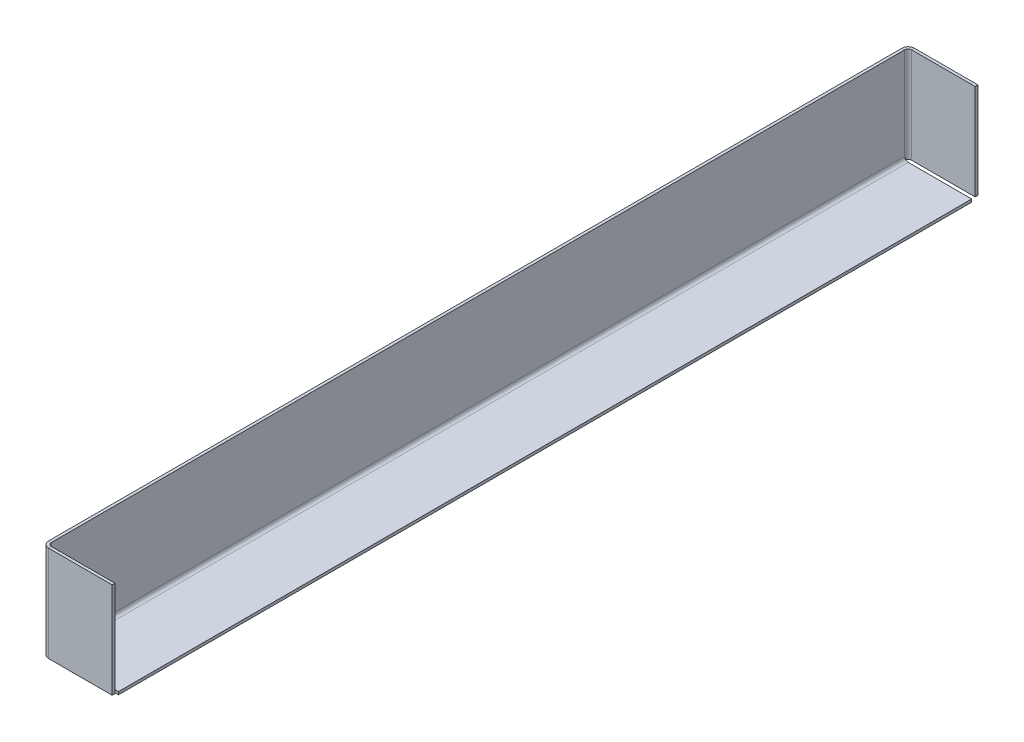
ISO-10303-21;
HEADER;
FILE_DESCRIPTION(('STEP AP214'),'2;1');
FILE_NAME('part.step','',(''),(''),'','','');
FILE_SCHEMA(('AUTOMOTIVE_DESIGN { 1 0 10303 214 1 1 1 1 }'));
ENDSEC;
DATA;
#1=APPLICATION_CONTEXT('core data for automotive mechanical design processes');
#2=APPLICATION_PROTOCOL_DEFINITION('international standard','automotive_design',2000,#1);
#3=PRODUCT_CONTEXT('',#1,'mechanical');
#4=PRODUCT('Part','Part','',(#3));
#5=PRODUCT_RELATED_PRODUCT_CATEGORY('part','',(#4));
#6=PRODUCT_DEFINITION_FORMATION('','',#4);
#7=PRODUCT_DEFINITION_CONTEXT('part definition',#1,'design');
#8=PRODUCT_DEFINITION('design','',#6,#7);
#9=PRODUCT_DEFINITION_SHAPE('','',#8);
#10=(LENGTH_UNIT() NAMED_UNIT(*) SI_UNIT(.MILLI.,.METRE.));
#11=(NAMED_UNIT(*) PLANE_ANGLE_UNIT() SI_UNIT($,.RADIAN.));
#12=(NAMED_UNIT(*) SI_UNIT($,.STERADIAN.) SOLID_ANGLE_UNIT());
#13=UNCERTAINTY_MEASURE_WITH_UNIT(LENGTH_MEASURE(1.E-05),#10,'distance_accuracy_value','');
#14=(GEOMETRIC_REPRESENTATION_CONTEXT(3) GLOBAL_UNCERTAINTY_ASSIGNED_CONTEXT((#13)) GLOBAL_UNIT_ASSIGNED_CONTEXT((#10,
#11,#12)) REPRESENTATION_CONTEXT('',''));
#15=CARTESIAN_POINT('',(0.,0.,0.));
#16=DIRECTION('',(0.,0.,1.));
#17=DIRECTION('',(1.,0.,0.));
#18=AXIS2_PLACEMENT_3D('',#15,#16,#17);
#19=CARTESIAN_POINT('',(0.799999999999981,-13.7,-122.2));
#20=DIRECTION('',(0.,0.,1.));
#21=DIRECTION('',(1.,0.,0.));
#22=AXIS2_PLACEMENT_3D('',#19,#20,#21);
#23=PLANE('',#22);
#24=DIRECTION('',(-1.,0.,0.));
#25=VECTOR('',#24,1.);
#26=CARTESIAN_POINT('',(0.799999999999981,-13.7,-122.2));
#27=LINE('',#26,#25);
#28=CARTESIAN_POINT('',(0.30333704529039,-13.7,-122.2));
#29=VERTEX_POINT('',#28);
#30=CARTESIAN_POINT('',(0.,-13.7,-122.2));
#31=VERTEX_POINT('',#30);
#32=EDGE_CURVE('E57',#29,#31,#27,.T.);
#33=ORIENTED_EDGE('',*,*,#32,.F.);
#34=CARTESIAN_POINT('',(1.79999999999999,-12.7,-122.2));
#35=DIRECTION('',(0.,0.,-1.));
#36=DIRECTION('',(-1.,0.,0.));
#37=AXIS2_PLACEMENT_3D('',#34,#35,#36);
#38=CIRCLE('',#37,1.80000000000001);
#39=CARTESIAN_POINT('',(0.,-12.7,-122.2));
#40=VERTEX_POINT('',#39);
#41=EDGE_CURVE('E11',#29,#40,#38,.T.);
#42=ORIENTED_EDGE('',*,*,#41,.T.);
#43=DIRECTION('',(0.,1.,0.));
#44=VECTOR('',#43,1.);
#45=CARTESIAN_POINT('',(0.,13.7,-122.2));
#46=LINE('',#45,#44);
#47=EDGE_CURVE('E241',#31,#40,#46,.T.);
#48=ORIENTED_EDGE('',*,*,#47,.F.);
#49=EDGE_LOOP('',(#33,#42,#48));
#50=FACE_BOUND('',#49,.T.);
#51=ADVANCED_FACE('F40',(#50),#23,.T.);
#52=CARTESIAN_POINT('',(0.799999999999986,-12.7,122.2));
#53=DIRECTION('',(0.,0.,-1.));
#54=DIRECTION('',(-1.,0.,0.));
#55=AXIS2_PLACEMENT_3D('',#52,#53,#54);
#56=PLANE('',#55);
#57=DIRECTION('',(0.,-1.,0.));
#58=VECTOR('',#57,1.);
#59=CARTESIAN_POINT('',(0.,-13.7,122.2));
#60=LINE('',#59,#58);
#61=CARTESIAN_POINT('',(0.,-13.7,122.2));
#62=VERTEX_POINT('',#61);
#63=CARTESIAN_POINT('',(0.,-12.7,122.2));
#64=VERTEX_POINT('',#63);
#65=EDGE_CURVE('E328',#62,#64,#60,.F.);
#66=ORIENTED_EDGE('',*,*,#65,.T.);
#67=CARTESIAN_POINT('',(1.79999999999999,-12.7,122.2));
#68=DIRECTION('',(0.,0.,-1.));
#69=DIRECTION('',(-1.,0.,0.));
#70=AXIS2_PLACEMENT_3D('',#67,#68,#69);
#71=CIRCLE('',#70,1.80000000000001);
#72=CARTESIAN_POINT('',(0.303337045290411,-13.7,122.2));
#73=VERTEX_POINT('',#72);
#74=EDGE_CURVE('E230',#64,#73,#71,.F.);
#75=ORIENTED_EDGE('',*,*,#74,.T.);
#76=DIRECTION('',(-1.,0.,0.));
#77=VECTOR('',#76,1.);
#78=CARTESIAN_POINT('',(0.799999999999995,-13.7,122.2));
#79=LINE('',#78,#77);
#80=EDGE_CURVE('E333',#73,#62,#79,.T.);
#81=ORIENTED_EDGE('',*,*,#80,.T.);
#82=EDGE_LOOP('',(#66,#75,#81));
#83=FACE_BOUND('',#82,.T.);
#84=ADVANCED_FACE('F401',(#83),#56,.T.);
#85=CARTESIAN_POINT('',(0.8,0.,0.));
#86=DIRECTION('',(-1.,0.,0.));
#87=DIRECTION('',(0.,0.,1.));
#88=AXIS2_PLACEMENT_3D('',#85,#86,#87);
#89=PLANE('',#88);
#90=DIRECTION('',(0.,0.,-1.));
#91=VECTOR('',#90,1.);
#92=CARTESIAN_POINT('',(0.799999999999986,-12.7,-122.2));
#93=LINE('',#92,#91);
#94=CARTESIAN_POINT('',(0.799999999999986,-12.7,-122.2));
#95=VERTEX_POINT('',#94);
#96=CARTESIAN_POINT('',(0.799999999999986,-12.7,122.2));
#97=VERTEX_POINT('',#96);
#98=EDGE_CURVE('E236',#95,#97,#93,.F.);
#99=ORIENTED_EDGE('',*,*,#98,.F.);
#100=DIRECTION('',(0.,1.,0.));
#101=VECTOR('',#100,1.);
#102=CARTESIAN_POINT('',(0.799999999999981,13.7,-122.2));
#103=LINE('',#102,#101);
#104=CARTESIAN_POINT('',(0.799999999999981,13.7,-122.2));
#105=VERTEX_POINT('',#104);
#106=EDGE_CURVE('E288',#105,#95,#103,.F.);
#107=ORIENTED_EDGE('',*,*,#106,.F.);
#108=DIRECTION('',(0.,0.,1.));
#109=VECTOR('',#108,1.);
#110=CARTESIAN_POINT('',(0.8,13.7,-123.2));
#111=LINE('',#110,#109);
#112=CARTESIAN_POINT('',(0.799999999999995,13.7,122.2));
#113=VERTEX_POINT('',#112);
#114=EDGE_CURVE('E49',#105,#113,#111,.T.);
#115=ORIENTED_EDGE('',*,*,#114,.T.);
#116=DIRECTION('',(0.,-1.,0.));
#117=VECTOR('',#116,1.);
#118=CARTESIAN_POINT('',(0.799999999999995,-13.7,122.2));
#119=LINE('',#118,#117);
#120=EDGE_CURVE('E343',#97,#113,#119,.F.);
#121=ORIENTED_EDGE('',*,*,#120,.F.);
#122=EDGE_LOOP('',(#99,#107,#115,#121));
#123=FACE_BOUND('',#122,.T.);
#124=ADVANCED_FACE('F406',(#123),#89,.F.);
#125=CARTESIAN_POINT('',(0.,0.,0.));
#126=DIRECTION('',(-1.,0.,0.));
#127=DIRECTION('',(0.,0.,1.));
#128=AXIS2_PLACEMENT_3D('',#125,#126,#127);
#129=PLANE('',#128);
#130=DIRECTION('',(0.,1.,0.));
#131=VECTOR('',#130,1.);
#132=CARTESIAN_POINT('',(0.,13.7,-122.2));
#133=LINE('',#132,#131);
#134=CARTESIAN_POINT('',(0.,13.7,-122.2));
#135=VERTEX_POINT('',#134);
#136=EDGE_CURVE('E275',#135,#40,#133,.F.);
#137=ORIENTED_EDGE('',*,*,#136,.T.);
#138=DIRECTION('',(0.,0.,-1.));
#139=VECTOR('',#138,1.);
#140=CARTESIAN_POINT('',(0.,-12.7,-122.2));
#141=LINE('',#140,#139);
#142=EDGE_CURVE('E185',#40,#64,#141,.F.);
#143=ORIENTED_EDGE('',*,*,#142,.T.);
#144=CARTESIAN_POINT('',(0.,13.7,122.2));
#145=VERTEX_POINT('',#144);
#146=EDGE_CURVE('E65',#64,#145,#60,.F.);
#147=ORIENTED_EDGE('',*,*,#146,.T.);
#148=DIRECTION('',(0.,0.,1.));
#149=VECTOR('',#148,1.);
#150=CARTESIAN_POINT('',(0.,13.7,-123.2));
#151=LINE('',#150,#149);
#152=EDGE_CURVE('E44',#135,#145,#151,.T.);
#153=ORIENTED_EDGE('',*,*,#152,.F.);
#154=EDGE_LOOP('',(#137,#143,#147,#153));
#155=FACE_BOUND('',#154,.T.);
#156=ADVANCED_FACE('F461',(#155),#129,.T.);
#157=CARTESIAN_POINT('',(0.8,13.7,-123.2));
#158=DIRECTION('',(0.,-1.,0.));
#159=DIRECTION('',(0.,0.,-1.));
#160=AXIS2_PLACEMENT_3D('',#157,#158,#159);
#161=PLANE('',#160);
#162=DIRECTION('',(-1.,0.,0.));
#163=VECTOR('',#162,1.);
#164=CARTESIAN_POINT('',(0.799999999999981,13.7,-122.2));
#165=LINE('',#164,#163);
#166=EDGE_CURVE('E282',#105,#135,#165,.T.);
#167=ORIENTED_EDGE('',*,*,#166,.T.);
#168=ORIENTED_EDGE('',*,*,#152,.T.);
#169=DIRECTION('',(-1.,0.,0.));
#170=VECTOR('',#169,1.);
#171=CARTESIAN_POINT('',(0.799999999999995,13.7,122.2));
#172=LINE('',#171,#170);
#173=EDGE_CURVE('E346',#113,#145,#172,.T.);
#174=ORIENTED_EDGE('',*,*,#173,.F.);
#175=ORIENTED_EDGE('',*,*,#114,.F.);
#176=EDGE_LOOP('',(#167,#168,#174,#175));
#177=FACE_BOUND('',#176,.T.);
#178=ADVANCED_FACE('F42',(#177),#161,.F.);
#179=CARTESIAN_POINT('',(1.8,13.7,122.2));
#180=DIRECTION('',(0.,1.,0.));
#181=DIRECTION('',(0.,0.,1.));
#182=AXIS2_PLACEMENT_3D('',#179,#180,#181);
#183=PLANE('',#182);
#184=DIRECTION('',(0.,0.,1.));
#185=VECTOR('',#184,1.);
#186=CARTESIAN_POINT('',(1.8,13.7,123.2));
#187=LINE('',#186,#185);
#188=CARTESIAN_POINT('',(1.79999999999999,13.7,123.2));
#189=VERTEX_POINT('',#188);
#190=CARTESIAN_POINT('',(1.79999999999999,13.7,124.));
#191=VERTEX_POINT('',#190);
#192=EDGE_CURVE('E295',#189,#191,#187,.T.);
#193=ORIENTED_EDGE('',*,*,#192,.F.);
#194=CARTESIAN_POINT('',(1.8,13.7,122.2));
#195=DIRECTION('',(0.,-1.,0.));
#196=DIRECTION('',(0.,0.,-1.));
#197=AXIS2_PLACEMENT_3D('',#194,#195,#196);
#198=CIRCLE('',#197,1.);
#199=EDGE_CURVE('E337',#113,#189,#198,.F.);
#200=ORIENTED_EDGE('',*,*,#199,.F.);
#201=ORIENTED_EDGE('',*,*,#173,.T.);
#202=CARTESIAN_POINT('',(1.8,13.7,122.2));
#203=DIRECTION('',(0.,-1.,0.));
#204=DIRECTION('',(0.,0.,-1.));
#205=AXIS2_PLACEMENT_3D('',#202,#203,#204);
#206=CIRCLE('',#205,1.8);
#207=EDGE_CURVE('E330',#145,#191,#206,.F.);
#208=ORIENTED_EDGE('',*,*,#207,.T.);
#209=EDGE_LOOP('',(#193,#200,#201,#208));
#210=FACE_BOUND('',#209,.T.);
#211=ADVANCED_FACE('F365',(#210),#183,.T.);
#212=CARTESIAN_POINT('',(1.8,-13.7,122.2));
#213=DIRECTION('',(0.,1.,0.));
#214=DIRECTION('',(0.,0.,1.));
#215=AXIS2_PLACEMENT_3D('',#212,#213,#214);
#216=PLANE('',#215);
#217=CARTESIAN_POINT('',(1.8,-13.7,122.2));
#218=DIRECTION('',(0.,-1.,0.));
#219=DIRECTION('',(0.,0.,-1.));
#220=AXIS2_PLACEMENT_3D('',#217,#218,#219);
#221=CIRCLE('',#220,1.);
#222=CARTESIAN_POINT('',(1.79999999999999,-13.7,123.2));
#223=VERTEX_POINT('',#222);
#224=CARTESIAN_POINT('',(0.799999999999995,-13.7,122.2));
#225=VERTEX_POINT('',#224);
#226=EDGE_CURVE('E327',#223,#225,#221,.T.);
#227=ORIENTED_EDGE('',*,*,#226,.F.);
#228=DIRECTION('',(0.,0.,1.));
#229=VECTOR('',#228,1.);
#230=CARTESIAN_POINT('',(1.8,-13.7,123.2));
#231=LINE('',#230,#229);
#232=CARTESIAN_POINT('',(1.8,-13.7,124.));
#233=VERTEX_POINT('',#232);
#234=EDGE_CURVE('E300',#223,#233,#231,.T.);
#235=ORIENTED_EDGE('',*,*,#234,.T.);
#236=CARTESIAN_POINT('',(1.8,-13.7,122.2));
#237=DIRECTION('',(0.,-1.,0.));
#238=DIRECTION('',(0.,0.,-1.));
#239=AXIS2_PLACEMENT_3D('',#236,#237,#238);
#240=CIRCLE('',#239,1.8);
#241=EDGE_CURVE('E334',#233,#62,#240,.T.);
#242=ORIENTED_EDGE('',*,*,#241,.T.);
#243=ORIENTED_EDGE('',*,*,#80,.F.);
#244=EDGE_CURVE('E349',#225,#73,#79,.T.);
#245=ORIENTED_EDGE('',*,*,#244,.F.);
#246=EDGE_LOOP('',(#227,#235,#242,#243,#245));
#247=FACE_BOUND('',#246,.T.);
#248=ADVANCED_FACE('F388',(#247),#216,.F.);
#249=CARTESIAN_POINT('',(1.8,-13.7,122.2));
#250=DIRECTION('',(0.,-1.,0.));
#251=DIRECTION('',(0.,0.,1.));
#252=AXIS2_PLACEMENT_3D('',#249,#250,#251);
#253=CYLINDRICAL_SURFACE('',#252,1.8);
#254=ORIENTED_EDGE('',*,*,#65,.F.);
#255=ORIENTED_EDGE('',*,*,#241,.F.);
#256=DIRECTION('',(0.,1.,0.));
#257=VECTOR('',#256,1.);
#258=CARTESIAN_POINT('',(1.8,0.,124.));
#259=LINE('',#258,#257);
#260=EDGE_CURVE('E303',#233,#191,#259,.T.);
#261=ORIENTED_EDGE('',*,*,#260,.T.);
#262=ORIENTED_EDGE('',*,*,#207,.F.);
#263=ORIENTED_EDGE('',*,*,#146,.F.);
#264=EDGE_LOOP('',(#254,#255,#261,#262,#263));
#265=FACE_BOUND('',#264,.T.);
#266=ADVANCED_FACE('F361',(#265),#253,.T.);
#267=CARTESIAN_POINT('',(1.8,-13.7,122.2));
#268=DIRECTION('',(0.,-1.,0.));
#269=DIRECTION('',(0.,0.,1.));
#270=AXIS2_PLACEMENT_3D('',#267,#268,#269);
#271=CYLINDRICAL_SURFACE('',#270,1.);
#272=EDGE_CURVE('E340',#225,#97,#119,.F.);
#273=ORIENTED_EDGE('',*,*,#272,.T.);
#274=ORIENTED_EDGE('',*,*,#120,.T.);
#275=ORIENTED_EDGE('',*,*,#199,.T.);
#276=DIRECTION('',(0.,-1.,0.));
#277=VECTOR('',#276,1.);
#278=CARTESIAN_POINT('',(1.8,13.7,123.2));
#279=LINE('',#278,#277);
#280=EDGE_CURVE('E298',#189,#223,#279,.T.);
#281=ORIENTED_EDGE('',*,*,#280,.T.);
#282=ORIENTED_EDGE('',*,*,#226,.T.);
#283=EDGE_LOOP('',(#273,#274,#275,#281,#282));
#284=FACE_BOUND('',#283,.T.);
#285=ADVANCED_FACE('F368',(#284),#271,.F.);
#286=CARTESIAN_POINT('',(20.,-13.7,124.));
#287=DIRECTION('',(0.,1.,0.));
#288=DIRECTION('',(0.,0.,1.));
#289=AXIS2_PLACEMENT_3D('',#286,#287,#288);
#290=PLANE('',#289);
#291=ORIENTED_EDGE('',*,*,#234,.F.);
#292=DIRECTION('',(1.,0.,0.));
#293=VECTOR('',#292,1.);
#294=CARTESIAN_POINT('',(20.,-13.7,123.2));
#295=LINE('',#294,#293);
#296=CARTESIAN_POINT('',(20.,-13.7,123.2));
#297=VERTEX_POINT('',#296);
#298=EDGE_CURVE('E307',#223,#297,#295,.T.);
#299=ORIENTED_EDGE('',*,*,#298,.T.);
#300=DIRECTION('',(0.,0.,-1.));
#301=VECTOR('',#300,1.);
#302=CARTESIAN_POINT('',(20.,-13.7,124.));
#303=LINE('',#302,#301);
#304=CARTESIAN_POINT('',(20.,-13.7,124.));
#305=VERTEX_POINT('',#304);
#306=EDGE_CURVE('E324',#305,#297,#303,.T.);
#307=ORIENTED_EDGE('',*,*,#306,.F.);
#308=DIRECTION('',(1.,0.,0.));
#309=VECTOR('',#308,1.);
#310=CARTESIAN_POINT('',(20.,-13.7,124.));
#311=LINE('',#310,#309);
#312=EDGE_CURVE('E308',#233,#305,#311,.T.);
#313=ORIENTED_EDGE('',*,*,#312,.F.);
#314=EDGE_LOOP('',(#291,#299,#307,#313));
#315=FACE_BOUND('',#314,.T.);
#316=ADVANCED_FACE('F386',(#315),#290,.F.);
#317=CARTESIAN_POINT('',(0.799999999999997,13.7,124.));
#318=DIRECTION('',(0.,-1.,0.));
#319=DIRECTION('',(0.,0.,-1.));
#320=AXIS2_PLACEMENT_3D('',#317,#318,#319);
#321=PLANE('',#320);
#322=ORIENTED_EDGE('',*,*,#192,.T.);
#323=DIRECTION('',(-1.,0.,0.));
#324=VECTOR('',#323,1.);
#325=CARTESIAN_POINT('',(0.799999999999997,13.7,124.));
#326=LINE('',#325,#324);
#327=CARTESIAN_POINT('',(20.,13.7,124.));
#328=VERTEX_POINT('',#327);
#329=EDGE_CURVE('E313',#328,#191,#326,.T.);
#330=ORIENTED_EDGE('',*,*,#329,.F.);
#331=DIRECTION('',(0.,0.,-1.));
#332=VECTOR('',#331,1.);
#333=CARTESIAN_POINT('',(20.,13.7,124.));
#334=LINE('',#333,#332);
#335=CARTESIAN_POINT('',(20.,13.7,123.2));
#336=VERTEX_POINT('',#335);
#337=EDGE_CURVE('E316',#328,#336,#334,.T.);
#338=ORIENTED_EDGE('',*,*,#337,.T.);
#339=DIRECTION('',(-1.,0.,0.));
#340=VECTOR('',#339,1.);
#341=CARTESIAN_POINT('',(0.8,13.7,123.2));
#342=LINE('',#341,#340);
#343=EDGE_CURVE('E311',#336,#189,#342,.T.);
#344=ORIENTED_EDGE('',*,*,#343,.T.);
#345=EDGE_LOOP('',(#322,#330,#338,#344));
#346=FACE_BOUND('',#345,.T.);
#347=ADVANCED_FACE('F376',(#346),#321,.F.);
#348=CARTESIAN_POINT('',(-4.48038877238455E-13,0.,124.));
#349=DIRECTION('',(0.,0.,-1.));
#350=DIRECTION('',(-1.,0.,0.));
#351=AXIS2_PLACEMENT_3D('',#348,#349,#350);
#352=PLANE('',#351);
#353=ORIENTED_EDGE('',*,*,#260,.F.);
#354=ORIENTED_EDGE('',*,*,#312,.T.);
#355=DIRECTION('',(0.,1.,0.));
#356=VECTOR('',#355,1.);
#357=CARTESIAN_POINT('',(20.,13.7,124.));
#358=LINE('',#357,#356);
#359=EDGE_CURVE('E310',#305,#328,#358,.T.);
#360=ORIENTED_EDGE('',*,*,#359,.T.);
#361=ORIENTED_EDGE('',*,*,#329,.T.);
#362=EDGE_LOOP('',(#353,#354,#360,#361));
#363=FACE_BOUND('',#362,.T.);
#364=ADVANCED_FACE('F390',(#363),#352,.F.);
#365=CARTESIAN_POINT('',(-4.45245692167381E-13,0.,123.2));
#366=DIRECTION('',(0.,0.,-1.));
#367=DIRECTION('',(-1.,0.,0.));
#368=AXIS2_PLACEMENT_3D('',#365,#366,#367);
#369=PLANE('',#368);
#370=ORIENTED_EDGE('',*,*,#298,.F.);
#371=ORIENTED_EDGE('',*,*,#280,.F.);
#372=ORIENTED_EDGE('',*,*,#343,.F.);
#373=DIRECTION('',(0.,1.,0.));
#374=VECTOR('',#373,1.);
#375=CARTESIAN_POINT('',(20.,13.7,123.2));
#376=LINE('',#375,#374);
#377=EDGE_CURVE('E318',#297,#336,#376,.T.);
#378=ORIENTED_EDGE('',*,*,#377,.F.);
#379=EDGE_LOOP('',(#370,#371,#372,#378));
#380=FACE_BOUND('',#379,.T.);
#381=ADVANCED_FACE('F373',(#380),#369,.T.);
#382=CARTESIAN_POINT('',(20.,13.7,124.));
#383=DIRECTION('',(-1.,0.,0.));
#384=DIRECTION('',(0.,0.,1.));
#385=AXIS2_PLACEMENT_3D('',#382,#383,#384);
#386=PLANE('',#385);
#387=ORIENTED_EDGE('',*,*,#377,.T.);
#388=ORIENTED_EDGE('',*,*,#337,.F.);
#389=ORIENTED_EDGE('',*,*,#359,.F.);
#390=ORIENTED_EDGE('',*,*,#306,.T.);
#391=EDGE_LOOP('',(#387,#388,#389,#390));
#392=FACE_BOUND('',#391,.T.);
#393=ADVANCED_FACE('F381',(#392),#386,.F.);
#394=CARTESIAN_POINT('',(1.8,-13.7,-122.2));
#395=DIRECTION('',(0.,-1.,0.));
#396=DIRECTION('',(0.,0.,-1.));
#397=AXIS2_PLACEMENT_3D('',#394,#395,#396);
#398=PLANE('',#397);
#399=DIRECTION('',(0.,0.,-1.));
#400=VECTOR('',#399,1.);
#401=CARTESIAN_POINT('',(1.8,-13.7,-123.2));
#402=LINE('',#401,#400);
#403=CARTESIAN_POINT('',(1.79999999999999,-13.7,-123.2));
#404=VERTEX_POINT('',#403);
#405=CARTESIAN_POINT('',(1.79999999999999,-13.7,-124.));
#406=VERTEX_POINT('',#405);
#407=EDGE_CURVE('E244',#404,#406,#402,.T.);
#408=ORIENTED_EDGE('',*,*,#407,.F.);
#409=CARTESIAN_POINT('',(1.8,-13.7,-122.2));
#410=DIRECTION('',(0.,1.,0.));
#411=DIRECTION('',(0.,0.,1.));
#412=AXIS2_PLACEMENT_3D('',#409,#410,#411);
#413=CIRCLE('',#412,1.00000000000001);
#414=CARTESIAN_POINT('',(0.799999999999981,-13.7,-122.2));
#415=VERTEX_POINT('',#414);
#416=EDGE_CURVE('E285',#415,#404,#413,.F.);
#417=ORIENTED_EDGE('',*,*,#416,.F.);
#418=EDGE_CURVE('E293',#415,#29,#27,.T.);
#419=ORIENTED_EDGE('',*,*,#418,.T.);
#420=ORIENTED_EDGE('',*,*,#32,.T.);
#421=CARTESIAN_POINT('',(1.8,-13.7,-122.2));
#422=DIRECTION('',(0.,1.,0.));
#423=DIRECTION('',(0.,0.,1.));
#424=AXIS2_PLACEMENT_3D('',#421,#422,#423);
#425=CIRCLE('',#424,1.80000000000001);
#426=EDGE_CURVE('E278',#31,#406,#425,.F.);
#427=ORIENTED_EDGE('',*,*,#426,.T.);
#428=EDGE_LOOP('',(#408,#417,#419,#420,#427));
#429=FACE_BOUND('',#428,.T.);
#430=ADVANCED_FACE('F440',(#429),#398,.T.);
#431=CARTESIAN_POINT('',(1.8,13.7,-122.2));
#432=DIRECTION('',(0.,-1.,0.));
#433=DIRECTION('',(0.,0.,-1.));
#434=AXIS2_PLACEMENT_3D('',#431,#432,#433);
#435=PLANE('',#434);
#436=CARTESIAN_POINT('',(1.8,13.7,-122.2));
#437=DIRECTION('',(0.,1.,0.));
#438=DIRECTION('',(0.,0.,1.));
#439=AXIS2_PLACEMENT_3D('',#436,#437,#438);
#440=CIRCLE('',#439,1.00000000000001);
#441=CARTESIAN_POINT('',(1.79999999999999,13.7,-123.2));
#442=VERTEX_POINT('',#441);
#443=EDGE_CURVE('E274',#442,#105,#440,.T.);
#444=ORIENTED_EDGE('',*,*,#443,.F.);
#445=DIRECTION('',(0.,0.,-1.));
#446=VECTOR('',#445,1.);
#447=CARTESIAN_POINT('',(1.8,13.7,-123.2));
#448=LINE('',#447,#446);
#449=CARTESIAN_POINT('',(1.8,13.7,-124.));
#450=VERTEX_POINT('',#449);
#451=EDGE_CURVE('E247',#442,#450,#448,.T.);
#452=ORIENTED_EDGE('',*,*,#451,.T.);
#453=CARTESIAN_POINT('',(1.8,13.7,-122.2));
#454=DIRECTION('',(0.,1.,0.));
#455=DIRECTION('',(0.,0.,1.));
#456=AXIS2_PLACEMENT_3D('',#453,#454,#455);
#457=CIRCLE('',#456,1.80000000000001);
#458=EDGE_CURVE('E279',#450,#135,#457,.T.);
#459=ORIENTED_EDGE('',*,*,#458,.T.);
#460=ORIENTED_EDGE('',*,*,#166,.F.);
#461=EDGE_LOOP('',(#444,#452,#459,#460));
#462=FACE_BOUND('',#461,.T.);
#463=ADVANCED_FACE('F435',(#462),#435,.F.);
#464=CARTESIAN_POINT('',(1.8,13.7,-122.2));
#465=DIRECTION('',(0.,1.,0.));
#466=DIRECTION('',(0.,0.,-1.));
#467=AXIS2_PLACEMENT_3D('',#464,#465,#466);
#468=CYLINDRICAL_SURFACE('',#467,1.80000000000001);
#469=ORIENTED_EDGE('',*,*,#136,.F.);
#470=ORIENTED_EDGE('',*,*,#458,.F.);
#471=DIRECTION('',(0.,-1.,0.));
#472=VECTOR('',#471,1.);
#473=CARTESIAN_POINT('',(1.8,0.,-124.));
#474=LINE('',#473,#472);
#475=EDGE_CURVE('E250',#450,#406,#474,.T.);
#476=ORIENTED_EDGE('',*,*,#475,.T.);
#477=ORIENTED_EDGE('',*,*,#426,.F.);
#478=ORIENTED_EDGE('',*,*,#47,.T.);
#479=EDGE_LOOP('',(#469,#470,#476,#477,#478));
#480=FACE_BOUND('',#479,.T.);
#481=ADVANCED_FACE('F432',(#480),#468,.T.);
#482=CARTESIAN_POINT('',(1.8,13.7,-122.2));
#483=DIRECTION('',(0.,1.,0.));
#484=DIRECTION('',(0.,0.,-1.));
#485=AXIS2_PLACEMENT_3D('',#482,#483,#484);
#486=CYLINDRICAL_SURFACE('',#485,1.00000000000001);
#487=ORIENTED_EDGE('',*,*,#106,.T.);
#488=DIRECTION('',(0.,1.,0.));
#489=VECTOR('',#488,1.);
#490=CARTESIAN_POINT('',(0.799999999999981,-13.7,-122.2));
#491=LINE('',#490,#489);
#492=EDGE_CURVE('E232',#415,#95,#491,.T.);
#493=ORIENTED_EDGE('',*,*,#492,.F.);
#494=ORIENTED_EDGE('',*,*,#416,.T.);
#495=DIRECTION('',(0.,1.,0.));
#496=VECTOR('',#495,1.);
#497=CARTESIAN_POINT('',(1.8,-13.7,-123.2));
#498=LINE('',#497,#496);
#499=EDGE_CURVE('E245',#404,#442,#498,.T.);
#500=ORIENTED_EDGE('',*,*,#499,.T.);
#501=ORIENTED_EDGE('',*,*,#443,.T.);
#502=EDGE_LOOP('',(#487,#493,#494,#500,#501));
#503=FACE_BOUND('',#502,.T.);
#504=ADVANCED_FACE('F430',(#503),#486,.F.);
#505=CARTESIAN_POINT('',(0.799999999999997,-13.7,-124.));
#506=DIRECTION('',(0.,1.,0.));
#507=DIRECTION('',(0.,0.,1.));
#508=AXIS2_PLACEMENT_3D('',#505,#506,#507);
#509=PLANE('',#508);
#510=ORIENTED_EDGE('',*,*,#407,.T.);
#511=DIRECTION('',(-1.,0.,0.));
#512=VECTOR('',#511,1.);
#513=CARTESIAN_POINT('',(0.799999999999997,-13.7,-124.));
#514=LINE('',#513,#512);
#515=CARTESIAN_POINT('',(20.,-13.7,-124.));
#516=VERTEX_POINT('',#515);
#517=EDGE_CURVE('E255',#516,#406,#514,.T.);
#518=ORIENTED_EDGE('',*,*,#517,.F.);
#519=DIRECTION('',(0.,0.,1.));
#520=VECTOR('',#519,1.);
#521=CARTESIAN_POINT('',(20.,-13.7,-124.));
#522=LINE('',#521,#520);
#523=CARTESIAN_POINT('',(20.,-13.7,-123.2));
#524=VERTEX_POINT('',#523);
#525=EDGE_CURVE('E263',#516,#524,#522,.T.);
#526=ORIENTED_EDGE('',*,*,#525,.T.);
#527=DIRECTION('',(-1.,0.,0.));
#528=VECTOR('',#527,1.);
#529=CARTESIAN_POINT('',(0.8,-13.7,-123.2));
#530=LINE('',#529,#528);
#531=EDGE_CURVE('E254',#524,#404,#530,.T.);
#532=ORIENTED_EDGE('',*,*,#531,.T.);
#533=EDGE_LOOP('',(#510,#518,#526,#532));
#534=FACE_BOUND('',#533,.T.);
#535=ADVANCED_FACE('F426',(#534),#509,.F.);
#536=CARTESIAN_POINT('',(20.,13.7,-124.));
#537=DIRECTION('',(0.,-1.,0.));
#538=DIRECTION('',(0.,0.,-1.));
#539=AXIS2_PLACEMENT_3D('',#536,#537,#538);
#540=PLANE('',#539);
#541=ORIENTED_EDGE('',*,*,#451,.F.);
#542=DIRECTION('',(1.,0.,0.));
#543=VECTOR('',#542,1.);
#544=CARTESIAN_POINT('',(20.,13.7,-123.2));
#545=LINE('',#544,#543);
#546=CARTESIAN_POINT('',(20.,13.7,-123.2));
#547=VERTEX_POINT('',#546);
#548=EDGE_CURVE('E266',#442,#547,#545,.T.);
#549=ORIENTED_EDGE('',*,*,#548,.T.);
#550=DIRECTION('',(0.,0.,1.));
#551=VECTOR('',#550,1.);
#552=CARTESIAN_POINT('',(20.,13.7,-124.));
#553=LINE('',#552,#551);
#554=CARTESIAN_POINT('',(20.,13.7,-124.));
#555=VERTEX_POINT('',#554);
#556=EDGE_CURVE('E271',#555,#547,#553,.T.);
#557=ORIENTED_EDGE('',*,*,#556,.F.);
#558=DIRECTION('',(1.,0.,0.));
#559=VECTOR('',#558,1.);
#560=CARTESIAN_POINT('',(20.,13.7,-124.));
#561=LINE('',#560,#559);
#562=EDGE_CURVE('E258',#450,#555,#561,.T.);
#563=ORIENTED_EDGE('',*,*,#562,.F.);
#564=EDGE_LOOP('',(#541,#549,#557,#563));
#565=FACE_BOUND('',#564,.T.);
#566=ADVANCED_FACE('F415',(#565),#540,.F.);
#567=CARTESIAN_POINT('',(-3.58989738804979E-13,0.,-124.));
#568=DIRECTION('',(0.,0.,1.));
#569=DIRECTION('',(1.,0.,0.));
#570=AXIS2_PLACEMENT_3D('',#567,#568,#569);
#571=PLANE('',#570);
#572=ORIENTED_EDGE('',*,*,#475,.F.);
#573=ORIENTED_EDGE('',*,*,#562,.T.);
#574=DIRECTION('',(0.,-1.,0.));
#575=VECTOR('',#574,1.);
#576=CARTESIAN_POINT('',(20.,-13.7,-124.));
#577=LINE('',#576,#575);
#578=EDGE_CURVE('E261',#555,#516,#577,.T.);
#579=ORIENTED_EDGE('',*,*,#578,.T.);
#580=ORIENTED_EDGE('',*,*,#517,.T.);
#581=EDGE_LOOP('',(#572,#573,#579,#580));
#582=FACE_BOUND('',#581,.T.);
#583=ADVANCED_FACE('F411',(#582),#571,.F.);
#584=CARTESIAN_POINT('',(-3.56196553733904E-13,0.,-123.2));
#585=DIRECTION('',(0.,0.,1.));
#586=DIRECTION('',(1.,0.,0.));
#587=AXIS2_PLACEMENT_3D('',#584,#585,#586);
#588=PLANE('',#587);
#589=ORIENTED_EDGE('',*,*,#548,.F.);
#590=ORIENTED_EDGE('',*,*,#499,.F.);
#591=ORIENTED_EDGE('',*,*,#531,.F.);
#592=DIRECTION('',(0.,-1.,0.));
#593=VECTOR('',#592,1.);
#594=CARTESIAN_POINT('',(20.,-13.7,-123.2));
#595=LINE('',#594,#593);
#596=EDGE_CURVE('E259',#547,#524,#595,.T.);
#597=ORIENTED_EDGE('',*,*,#596,.F.);
#598=EDGE_LOOP('',(#589,#590,#591,#597));
#599=FACE_BOUND('',#598,.T.);
#600=ADVANCED_FACE('F414',(#599),#588,.T.);
#601=CARTESIAN_POINT('',(20.,-13.7,-124.));
#602=DIRECTION('',(-1.,0.,0.));
#603=DIRECTION('',(0.,0.,1.));
#604=AXIS2_PLACEMENT_3D('',#601,#602,#603);
#605=PLANE('',#604);
#606=ORIENTED_EDGE('',*,*,#596,.T.);
#607=ORIENTED_EDGE('',*,*,#525,.F.);
#608=ORIENTED_EDGE('',*,*,#578,.F.);
#609=ORIENTED_EDGE('',*,*,#556,.T.);
#610=EDGE_LOOP('',(#606,#607,#608,#609));
#611=FACE_BOUND('',#610,.T.);
#612=ADVANCED_FACE('F419',(#611),#605,.F.);
#613=CARTESIAN_POINT('',(1.79999999999999,-12.7,-122.2));
#614=DIRECTION('',(0.,0.,1.));
#615=DIRECTION('',(1.,0.,0.));
#616=AXIS2_PLACEMENT_3D('',#613,#614,#615);
#617=PLANE('',#616);
#618=ORIENTED_EDGE('',*,*,#418,.F.);
#619=ORIENTED_EDGE('',*,*,#492,.T.);
#620=CARTESIAN_POINT('',(1.79999999999999,-12.7,-122.2));
#621=DIRECTION('',(0.,0.,-1.));
#622=DIRECTION('',(-1.,0.,0.));
#623=AXIS2_PLACEMENT_3D('',#620,#621,#622);
#624=CIRCLE('',#623,1.00000000000001);
#625=CARTESIAN_POINT('',(1.79999999999999,-13.7,-122.2));
#626=VERTEX_POINT('',#625);
#627=EDGE_CURVE('E193',#626,#95,#624,.T.);
#628=ORIENTED_EDGE('',*,*,#627,.F.);
#629=DIRECTION('',(0.,-1.,0.));
#630=VECTOR('',#629,1.);
#631=CARTESIAN_POINT('',(1.79999999999999,-13.7,-122.2));
#632=LINE('',#631,#630);
#633=CARTESIAN_POINT('',(1.79999999999999,-14.5,-122.2));
#634=VERTEX_POINT('',#633);
#635=EDGE_CURVE('E189',#626,#634,#632,.T.);
#636=ORIENTED_EDGE('',*,*,#635,.T.);
#637=EDGE_CURVE('E51',#634,#29,#38,.T.);
#638=ORIENTED_EDGE('',*,*,#637,.T.);
#639=EDGE_LOOP('',(#618,#619,#628,#636,#638));
#640=FACE_BOUND('',#639,.T.);
#641=ADVANCED_FACE('F190',(#640),#617,.F.);
#642=CARTESIAN_POINT('',(1.79999999999999,-12.7,122.2));
#643=DIRECTION('',(0.,0.,1.));
#644=DIRECTION('',(1.,0.,0.));
#645=AXIS2_PLACEMENT_3D('',#642,#643,#644);
#646=PLANE('',#645);
#647=ORIENTED_EDGE('',*,*,#272,.F.);
#648=ORIENTED_EDGE('',*,*,#244,.T.);
#649=CARTESIAN_POINT('',(1.79999999999999,-14.5,122.2));
#650=VERTEX_POINT('',#649);
#651=EDGE_CURVE('E229',#73,#650,#71,.F.);
#652=ORIENTED_EDGE('',*,*,#651,.T.);
#653=DIRECTION('',(0.,-1.,0.));
#654=VECTOR('',#653,1.);
#655=CARTESIAN_POINT('',(1.79999999999999,-13.7,122.2));
#656=LINE('',#655,#654);
#657=CARTESIAN_POINT('',(1.79999999999999,-13.7,122.2));
#658=VERTEX_POINT('',#657);
#659=EDGE_CURVE('E469',#658,#650,#656,.T.);
#660=ORIENTED_EDGE('',*,*,#659,.F.);
#661=CARTESIAN_POINT('',(1.79999999999999,-12.7,122.2));
#662=DIRECTION('',(0.,0.,-1.));
#663=DIRECTION('',(-1.,0.,0.));
#664=AXIS2_PLACEMENT_3D('',#661,#662,#663);
#665=CIRCLE('',#664,1.00000000000001);
#666=EDGE_CURVE('E186',#97,#658,#665,.F.);
#667=ORIENTED_EDGE('',*,*,#666,.F.);
#668=EDGE_LOOP('',(#647,#648,#652,#660,#667));
#669=FACE_BOUND('',#668,.T.);
#670=ADVANCED_FACE('F464',(#669),#646,.T.);
#671=CARTESIAN_POINT('',(1.79999999999999,-12.7,-122.2));
#672=DIRECTION('',(0.,0.,-1.));
#673=DIRECTION('',(0.,-1.,0.));
#674=AXIS2_PLACEMENT_3D('',#671,#672,#673);
#675=CYLINDRICAL_SURFACE('',#674,1.80000000000001);
#676=ORIENTED_EDGE('',*,*,#142,.F.);
#677=ORIENTED_EDGE('',*,*,#41,.F.);
#678=ORIENTED_EDGE('',*,*,#637,.F.);
#679=DIRECTION('',(0.,0.,1.));
#680=VECTOR('',#679,1.);
#681=CARTESIAN_POINT('',(1.79999999999999,-14.5,0.));
#682=LINE('',#681,#680);
#683=EDGE_CURVE('E181',#634,#650,#682,.T.);
#684=ORIENTED_EDGE('',*,*,#683,.T.);
#685=ORIENTED_EDGE('',*,*,#651,.F.);
#686=ORIENTED_EDGE('',*,*,#74,.F.);
#687=EDGE_LOOP('',(#676,#677,#678,#684,#685,#686));
#688=FACE_BOUND('',#687,.T.);
#689=ADVANCED_FACE('F178',(#688),#675,.T.);
#690=CARTESIAN_POINT('',(1.79999999999999,-12.7,-122.2));
#691=DIRECTION('',(0.,0.,-1.));
#692=DIRECTION('',(0.,-1.,0.));
#693=AXIS2_PLACEMENT_3D('',#690,#691,#692);
#694=CYLINDRICAL_SURFACE('',#693,1.00000000000001);
#695=ORIENTED_EDGE('',*,*,#98,.T.);
#696=ORIENTED_EDGE('',*,*,#666,.T.);
#697=DIRECTION('',(0.,0.,-1.));
#698=VECTOR('',#697,1.);
#699=CARTESIAN_POINT('',(1.79999999999999,-13.7,122.2));
#700=LINE('',#699,#698);
#701=EDGE_CURVE('E197',#658,#626,#700,.T.);
#702=ORIENTED_EDGE('',*,*,#701,.T.);
#703=ORIENTED_EDGE('',*,*,#627,.T.);
#704=EDGE_LOOP('',(#695,#696,#702,#703));
#705=FACE_BOUND('',#704,.T.);
#706=ADVANCED_FACE('F467',(#705),#694,.F.);
#707=CARTESIAN_POINT('',(20.,-14.5,-122.2));
#708=DIRECTION('',(0.,0.,1.));
#709=DIRECTION('',(0.,-1.,0.));
#710=AXIS2_PLACEMENT_3D('',#707,#708,#709);
#711=PLANE('',#710);
#712=ORIENTED_EDGE('',*,*,#635,.F.);
#713=DIRECTION('',(1.,0.,0.));
#714=VECTOR('',#713,1.);
#715=CARTESIAN_POINT('',(20.,-13.7,-122.2));
#716=LINE('',#715,#714);
#717=CARTESIAN_POINT('',(20.,-13.7,-122.2));
#718=VERTEX_POINT('',#717);
#719=EDGE_CURVE('E206',#626,#718,#716,.T.);
#720=ORIENTED_EDGE('',*,*,#719,.T.);
#721=DIRECTION('',(0.,1.,0.));
#722=VECTOR('',#721,1.);
#723=CARTESIAN_POINT('',(20.,-14.5,-122.2));
#724=LINE('',#723,#722);
#725=CARTESIAN_POINT('',(20.,-14.5,-122.2));
#726=VERTEX_POINT('',#725);
#727=EDGE_CURVE('E210',#726,#718,#724,.T.);
#728=ORIENTED_EDGE('',*,*,#727,.F.);
#729=DIRECTION('',(1.,0.,0.));
#730=VECTOR('',#729,1.);
#731=CARTESIAN_POINT('',(20.,-14.5,-122.2));
#732=LINE('',#731,#730);
#733=EDGE_CURVE('E202',#634,#726,#732,.T.);
#734=ORIENTED_EDGE('',*,*,#733,.F.);
#735=EDGE_LOOP('',(#712,#720,#728,#734));
#736=FACE_BOUND('',#735,.T.);
#737=ADVANCED_FACE('F208',(#736),#711,.F.);
#738=CARTESIAN_POINT('',(0.799999999999992,-14.5,122.2));
#739=DIRECTION('',(0.,0.,-1.));
#740=DIRECTION('',(0.,1.,0.));
#741=AXIS2_PLACEMENT_3D('',#738,#739,#740);
#742=PLANE('',#741);
#743=ORIENTED_EDGE('',*,*,#659,.T.);
#744=DIRECTION('',(-1.,0.,0.));
#745=VECTOR('',#744,1.);
#746=CARTESIAN_POINT('',(0.799999999999992,-14.5,122.2));
#747=LINE('',#746,#745);
#748=CARTESIAN_POINT('',(20.,-14.5000000000001,122.2));
#749=VERTEX_POINT('',#748);
#750=EDGE_CURVE('E205',#749,#650,#747,.T.);
#751=ORIENTED_EDGE('',*,*,#750,.F.);
#752=DIRECTION('',(0.,1.,0.));
#753=VECTOR('',#752,1.);
#754=CARTESIAN_POINT('',(20.,-14.5000000000001,122.2));
#755=LINE('',#754,#753);
#756=CARTESIAN_POINT('',(20.,-13.7000000000001,122.2));
#757=VERTEX_POINT('',#756);
#758=EDGE_CURVE('E222',#749,#757,#755,.T.);
#759=ORIENTED_EDGE('',*,*,#758,.T.);
#760=DIRECTION('',(-1.,0.,0.));
#761=VECTOR('',#760,1.);
#762=CARTESIAN_POINT('',(0.799999999999995,-13.7,122.2));
#763=LINE('',#762,#761);
#764=EDGE_CURVE('E213',#757,#658,#763,.T.);
#765=ORIENTED_EDGE('',*,*,#764,.T.);
#766=EDGE_LOOP('',(#743,#751,#759,#765));
#767=FACE_BOUND('',#766,.T.);
#768=ADVANCED_FACE('F476',(#767),#742,.F.);
#769=CARTESIAN_POINT('',(0.,-14.5,0.));
#770=DIRECTION('',(0.,1.,0.));
#771=DIRECTION('',(-1.,0.,0.));
#772=AXIS2_PLACEMENT_3D('',#769,#770,#771);
#773=PLANE('',#772);
#774=ORIENTED_EDGE('',*,*,#683,.F.);
#775=ORIENTED_EDGE('',*,*,#733,.T.);
#776=DIRECTION('',(0.,0.,1.));
#777=VECTOR('',#776,1.);
#778=CARTESIAN_POINT('',(20.,-14.5000000000001,122.2));
#779=LINE('',#778,#777);
#780=EDGE_CURVE('E212',#726,#749,#779,.T.);
#781=ORIENTED_EDGE('',*,*,#780,.T.);
#782=ORIENTED_EDGE('',*,*,#750,.T.);
#783=EDGE_LOOP('',(#774,#775,#781,#782));
#784=FACE_BOUND('',#783,.T.);
#785=ADVANCED_FACE('F201',(#784),#773,.F.);
#786=CARTESIAN_POINT('',(0.,-13.7,0.));
#787=DIRECTION('',(0.,1.,0.));
#788=DIRECTION('',(-1.,0.,0.));
#789=AXIS2_PLACEMENT_3D('',#786,#787,#788);
#790=PLANE('',#789);
#791=ORIENTED_EDGE('',*,*,#719,.F.);
#792=ORIENTED_EDGE('',*,*,#701,.F.);
#793=ORIENTED_EDGE('',*,*,#764,.F.);
#794=DIRECTION('',(0.,0.,1.));
#795=VECTOR('',#794,1.);
#796=CARTESIAN_POINT('',(20.,-13.7000000000001,122.2));
#797=LINE('',#796,#795);
#798=EDGE_CURVE('E217',#718,#757,#797,.T.);
#799=ORIENTED_EDGE('',*,*,#798,.F.);
#800=EDGE_LOOP('',(#791,#792,#793,#799));
#801=FACE_BOUND('',#800,.T.);
#802=ADVANCED_FACE('F474',(#801),#790,.T.);
#803=CARTESIAN_POINT('',(20.,-14.5000000000001,122.2));
#804=DIRECTION('',(-1.,0.,0.));
#805=DIRECTION('',(0.,-1.,0.));
#806=AXIS2_PLACEMENT_3D('',#803,#804,#805);
#807=PLANE('',#806);
#808=ORIENTED_EDGE('',*,*,#798,.T.);
#809=ORIENTED_EDGE('',*,*,#758,.F.);
#810=ORIENTED_EDGE('',*,*,#780,.F.);
#811=ORIENTED_EDGE('',*,*,#727,.T.);
#812=EDGE_LOOP('',(#808,#809,#810,#811));
#813=FACE_BOUND('',#812,.T.);
#814=ADVANCED_FACE('F479',(#813),#807,.F.);
#815=CLOSED_SHELL('',(#51,#84,#124,#156,#178,#211,#248,#266,#285,#316,#347,#364,#381,#393,#430,
#463,#481,#504,#535,#566,#583,#600,#612,#641,#670,#689,#706,#737,#768,#785,#802,#814));
#816=MANIFOLD_SOLID_BREP('B2',#815);
#817=ADVANCED_BREP_SHAPE_REPRESENTATION('',(#18,#816),#14);
#818=SHAPE_DEFINITION_REPRESENTATION(#9,#817);
ENDSEC;
END-ISO-10303-21;
